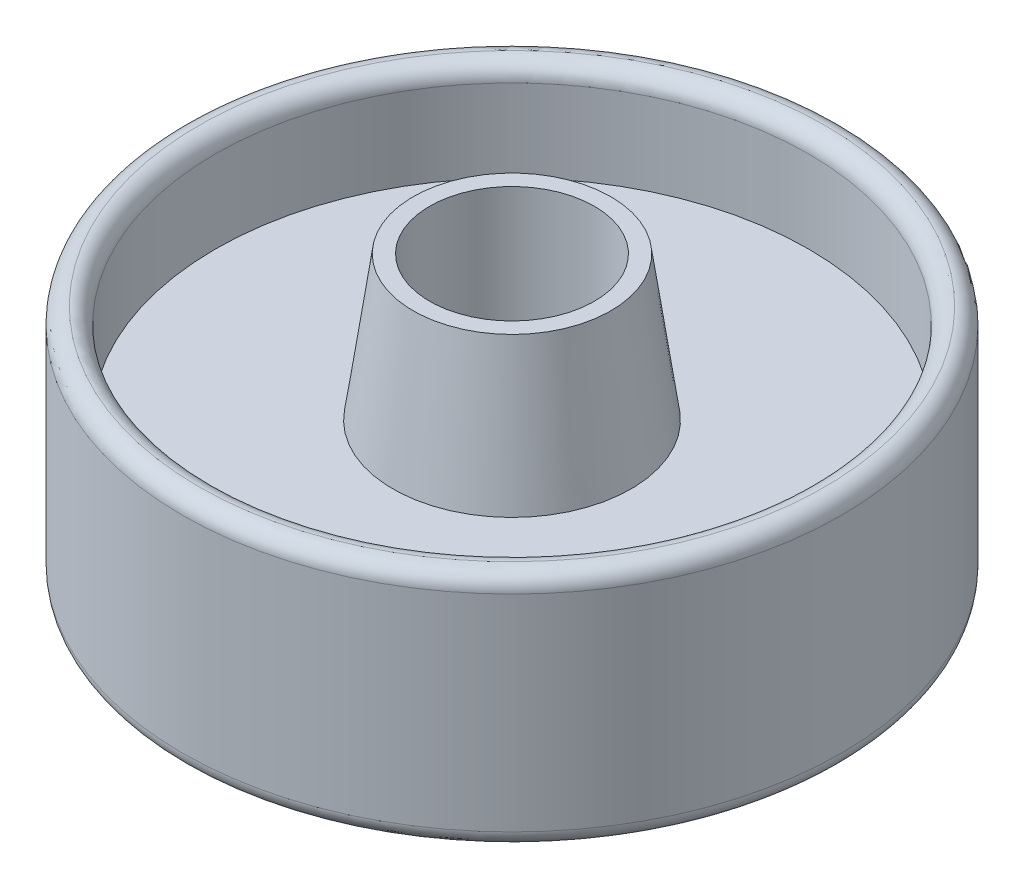
ISO-10303-21;
HEADER;
FILE_DESCRIPTION(('STEP AP214'),'2;1');
FILE_NAME('part.step','',(''),(''),'','','');
FILE_SCHEMA(('AUTOMOTIVE_DESIGN { 1 0 10303 214 1 1 1 1 }'));
ENDSEC;
DATA;
#1=APPLICATION_CONTEXT('core data for automotive mechanical design processes');
#2=APPLICATION_PROTOCOL_DEFINITION('international standard','automotive_design',2000,#1);
#3=PRODUCT_CONTEXT('',#1,'mechanical');
#4=PRODUCT('Part','Part','',(#3));
#5=PRODUCT_RELATED_PRODUCT_CATEGORY('part','',(#4));
#6=PRODUCT_DEFINITION_FORMATION('','',#4);
#7=PRODUCT_DEFINITION_CONTEXT('part definition',#1,'design');
#8=PRODUCT_DEFINITION('design','',#6,#7);
#9=PRODUCT_DEFINITION_SHAPE('','',#8);
#10=(LENGTH_UNIT() NAMED_UNIT(*) SI_UNIT(.MILLI.,.METRE.));
#11=(NAMED_UNIT(*) PLANE_ANGLE_UNIT() SI_UNIT($,.RADIAN.));
#12=(NAMED_UNIT(*) SI_UNIT($,.STERADIAN.) SOLID_ANGLE_UNIT());
#13=UNCERTAINTY_MEASURE_WITH_UNIT(LENGTH_MEASURE(1.E-05),#10,'distance_accuracy_value','');
#14=(GEOMETRIC_REPRESENTATION_CONTEXT(3) GLOBAL_UNCERTAINTY_ASSIGNED_CONTEXT((#13)) GLOBAL_UNIT_ASSIGNED_CONTEXT((#10,
#11,#12)) REPRESENTATION_CONTEXT('',''));
#15=CARTESIAN_POINT('',(0.,0.,0.));
#16=DIRECTION('',(0.,0.,1.));
#17=DIRECTION('',(1.,0.,0.));
#18=AXIS2_PLACEMENT_3D('',#15,#16,#17);
#19=CARTESIAN_POINT('',(0.,-24.5789863778332,0.));
#20=DIRECTION('',(0.,-1.,0.));
#21=DIRECTION('',(0.,0.,-1.));
#22=AXIS2_PLACEMENT_3D('',#19,#20,#21);
#23=CYLINDRICAL_SURFACE('',#22,10.);
#24=CARTESIAN_POINT('',(0.,-20.,0.));
#25=DIRECTION('',(0.,-1.,0.));
#26=DIRECTION('',(0.,0.,-1.));
#27=AXIS2_PLACEMENT_3D('',#24,#25,#26);
#28=CIRCLE('',#27,10.);
#29=CARTESIAN_POINT('',(0.,-20.,-10.));
#30=VERTEX_POINT('',#29);
#31=EDGE_CURVE('E120',#30,#30,#28,.T.);
#32=ORIENTED_EDGE('',*,*,#31,.T.);
#33=EDGE_LOOP('',(#32));
#34=FACE_BOUND('',#33,.T.);
#35=CARTESIAN_POINT('',(0.,20.,0.));
#36=DIRECTION('',(0.,-1.,0.));
#37=DIRECTION('',(0.,0.,-1.));
#38=AXIS2_PLACEMENT_3D('',#35,#36,#37);
#39=CIRCLE('',#38,10.);
#40=CARTESIAN_POINT('',(0.,20.,-10.));
#41=VERTEX_POINT('',#40);
#42=EDGE_CURVE('E58',#41,#41,#39,.T.);
#43=ORIENTED_EDGE('',*,*,#42,.F.);
#44=EDGE_LOOP('',(#43));
#45=FACE_BOUND('',#44,.T.);
#46=ADVANCED_FACE('F37',(#34,#45),#23,.F.);
#47=CARTESIAN_POINT('',(10.,-20.,0.));
#48=DIRECTION('',(0.,-1.,0.));
#49=DIRECTION('',(0.,0.,-1.));
#50=AXIS2_PLACEMENT_3D('',#47,#48,#49);
#51=PLANE('',#50);
#52=CARTESIAN_POINT('',(0.,-20.,0.));
#53=DIRECTION('',(0.,-1.,0.));
#54=DIRECTION('',(0.,0.,-1.));
#55=AXIS2_PLACEMENT_3D('',#52,#53,#54);
#56=CIRCLE('',#55,12.);
#57=CARTESIAN_POINT('',(0.,-20.,-12.));
#58=VERTEX_POINT('',#57);
#59=EDGE_CURVE('E125',#58,#58,#56,.T.);
#60=ORIENTED_EDGE('',*,*,#59,.T.);
#61=EDGE_LOOP('',(#60));
#62=FACE_BOUND('',#61,.T.);
#63=ORIENTED_EDGE('',*,*,#31,.F.);
#64=EDGE_LOOP('',(#63));
#65=FACE_BOUND('',#64,.T.);
#66=ADVANCED_FACE('F84',(#62,#65),#51,.T.);
#67=CARTESIAN_POINT('',(0.,-20.,0.));
#68=DIRECTION('',(0.,1.,0.));
#69=DIRECTION('',(0.,0.,1.));
#70=AXIS2_PLACEMENT_3D('',#67,#68,#69);
#71=CONICAL_SURFACE('',#70,12.,0.13962634015954);
#72=CARTESIAN_POINT('',(0.,-2.5,0.));
#73=DIRECTION('',(0.,-1.,0.));
#74=DIRECTION('',(0.,0.,-1.));
#75=AXIS2_PLACEMENT_3D('',#72,#73,#74);
#76=CIRCLE('',#75,14.4594646072917);
#77=CARTESIAN_POINT('',(0.,-2.5,-14.4594646072917));
#78=VERTEX_POINT('',#77);
#79=EDGE_CURVE('E129',#78,#78,#76,.T.);
#80=ORIENTED_EDGE('',*,*,#79,.T.);
#81=EDGE_LOOP('',(#80));
#82=FACE_BOUND('',#81,.T.);
#83=ORIENTED_EDGE('',*,*,#59,.F.);
#84=EDGE_LOOP('',(#83));
#85=FACE_BOUND('',#84,.T.);
#86=ADVANCED_FACE('F90',(#82,#85),#71,.T.);
#87=CARTESIAN_POINT('',(36.,-2.5,0.));
#88=DIRECTION('',(0.,-1.,0.));
#89=DIRECTION('',(0.,0.,-1.));
#90=AXIS2_PLACEMENT_3D('',#87,#88,#89);
#91=PLANE('',#90);
#92=CARTESIAN_POINT('',(0.,-2.5,0.));
#93=DIRECTION('',(0.,-1.,0.));
#94=DIRECTION('',(0.,0.,-1.));
#95=AXIS2_PLACEMENT_3D('',#92,#93,#94);
#96=CIRCLE('',#95,36.);
#97=CARTESIAN_POINT('',(0.,-2.5,-36.));
#98=VERTEX_POINT('',#97);
#99=EDGE_CURVE('E133',#98,#98,#96,.T.);
#100=ORIENTED_EDGE('',*,*,#99,.T.);
#101=EDGE_LOOP('',(#100));
#102=FACE_BOUND('',#101,.T.);
#103=ORIENTED_EDGE('',*,*,#79,.F.);
#104=EDGE_LOOP('',(#103));
#105=FACE_BOUND('',#104,.T.);
#106=ADVANCED_FACE('F169',(#102,#105),#91,.T.);
#107=CARTESIAN_POINT('',(0.,-24.5789863778332,0.));
#108=DIRECTION('',(0.,-1.,0.));
#109=DIRECTION('',(0.,0.,-1.));
#110=AXIS2_PLACEMENT_3D('',#107,#108,#109);
#111=CYLINDRICAL_SURFACE('',#110,36.);
#112=CARTESIAN_POINT('',(0.,-12.5,0.));
#113=DIRECTION('',(0.,-1.,0.));
#114=DIRECTION('',(0.,0.,-1.));
#115=AXIS2_PLACEMENT_3D('',#112,#113,#114);
#116=CIRCLE('',#115,36.);
#117=CARTESIAN_POINT('',(0.,-12.5,-36.));
#118=VERTEX_POINT('',#117);
#119=EDGE_CURVE('E10',#118,#118,#116,.T.);
#120=ORIENTED_EDGE('',*,*,#119,.T.);
#121=EDGE_LOOP('',(#120));
#122=FACE_BOUND('',#121,.T.);
#123=ORIENTED_EDGE('',*,*,#99,.F.);
#124=EDGE_LOOP('',(#123));
#125=FACE_BOUND('',#124,.T.);
#126=ADVANCED_FACE('F113',(#122,#125),#111,.F.);
#127=CARTESIAN_POINT('',(0.,-24.5789863778332,0.));
#128=DIRECTION('',(0.,-1.,0.));
#129=DIRECTION('',(0.,0.,-1.));
#130=AXIS2_PLACEMENT_3D('',#127,#128,#129);
#131=CYLINDRICAL_SURFACE('',#130,40.);
#132=CARTESIAN_POINT('',(0.,12.5,0.));
#133=DIRECTION('',(0.,1.,0.));
#134=DIRECTION('',(0.,0.,1.));
#135=AXIS2_PLACEMENT_3D('',#132,#133,#134);
#136=CIRCLE('',#135,40.);
#137=CARTESIAN_POINT('',(0.,12.5,40.));
#138=VERTEX_POINT('',#137);
#139=EDGE_CURVE('E46',#138,#138,#136,.F.);
#140=ORIENTED_EDGE('',*,*,#139,.T.);
#141=EDGE_LOOP('',(#140));
#142=FACE_BOUND('',#141,.T.);
#143=CARTESIAN_POINT('',(0.,-12.5,0.));
#144=DIRECTION('',(0.,-1.,0.));
#145=DIRECTION('',(0.,0.,-1.));
#146=AXIS2_PLACEMENT_3D('',#143,#144,#145);
#147=CIRCLE('',#146,40.);
#148=CARTESIAN_POINT('',(0.,-12.5,-40.));
#149=VERTEX_POINT('',#148);
#150=EDGE_CURVE('E52',#149,#149,#147,.F.);
#151=ORIENTED_EDGE('',*,*,#150,.T.);
#152=EDGE_LOOP('',(#151));
#153=FACE_BOUND('',#152,.T.);
#154=ADVANCED_FACE('F109',(#142,#153),#131,.T.);
#155=CARTESIAN_POINT('',(0.,-24.5789863778332,0.));
#156=DIRECTION('',(0.,-1.,0.));
#157=DIRECTION('',(0.,0.,-1.));
#158=AXIS2_PLACEMENT_3D('',#155,#156,#157);
#159=CYLINDRICAL_SURFACE('',#158,36.);
#160=CARTESIAN_POINT('',(0.,12.5,0.));
#161=DIRECTION('',(0.,1.,0.));
#162=DIRECTION('',(0.,0.,1.));
#163=AXIS2_PLACEMENT_3D('',#160,#161,#162);
#164=CIRCLE('',#163,36.);
#165=CARTESIAN_POINT('',(0.,12.5,36.));
#166=VERTEX_POINT('',#165);
#167=EDGE_CURVE('E117',#166,#166,#164,.T.);
#168=ORIENTED_EDGE('',*,*,#167,.T.);
#169=EDGE_LOOP('',(#168));
#170=FACE_BOUND('',#169,.T.);
#171=CARTESIAN_POINT('',(0.,2.5,0.));
#172=DIRECTION('',(0.,-1.,0.));
#173=DIRECTION('',(0.,0.,-1.));
#174=AXIS2_PLACEMENT_3D('',#171,#172,#173);
#175=CIRCLE('',#174,36.);
#176=CARTESIAN_POINT('',(0.,2.5,-36.));
#177=VERTEX_POINT('',#176);
#178=EDGE_CURVE('E137',#177,#177,#175,.T.);
#179=ORIENTED_EDGE('',*,*,#178,.T.);
#180=EDGE_LOOP('',(#179));
#181=FACE_BOUND('',#180,.T.);
#182=ADVANCED_FACE('F112',(#170,#181),#159,.F.);
#183=CARTESIAN_POINT('',(14.4594646072917,2.5,0.));
#184=DIRECTION('',(0.,1.,0.));
#185=DIRECTION('',(0.,0.,1.));
#186=AXIS2_PLACEMENT_3D('',#183,#184,#185);
#187=PLANE('',#186);
#188=CARTESIAN_POINT('',(0.,2.5,0.));
#189=DIRECTION('',(0.,-1.,0.));
#190=DIRECTION('',(0.,0.,-1.));
#191=AXIS2_PLACEMENT_3D('',#188,#189,#190);
#192=CIRCLE('',#191,14.4594646072917);
#193=CARTESIAN_POINT('',(0.,2.5,-14.4594646072917));
#194=VERTEX_POINT('',#193);
#195=EDGE_CURVE('E141',#194,#194,#192,.T.);
#196=ORIENTED_EDGE('',*,*,#195,.T.);
#197=EDGE_LOOP('',(#196));
#198=FACE_BOUND('',#197,.T.);
#199=ORIENTED_EDGE('',*,*,#178,.F.);
#200=EDGE_LOOP('',(#199));
#201=FACE_BOUND('',#200,.T.);
#202=ADVANCED_FACE('F152',(#198,#201),#187,.T.);
#203=CARTESIAN_POINT('',(0.,2.5,0.));
#204=DIRECTION('',(0.,-1.,0.));
#205=DIRECTION('',(0.,0.,-1.));
#206=AXIS2_PLACEMENT_3D('',#203,#204,#205);
#207=CONICAL_SURFACE('',#206,14.4594646072917,0.13962634015954);
#208=CARTESIAN_POINT('',(0.,20.,0.));
#209=DIRECTION('',(0.,-1.,0.));
#210=DIRECTION('',(0.,0.,-1.));
#211=AXIS2_PLACEMENT_3D('',#208,#209,#210);
#212=CIRCLE('',#211,12.);
#213=CARTESIAN_POINT('',(0.,20.,-12.));
#214=VERTEX_POINT('',#213);
#215=EDGE_CURVE('E64',#214,#214,#212,.T.);
#216=ORIENTED_EDGE('',*,*,#215,.T.);
#217=EDGE_LOOP('',(#216));
#218=FACE_BOUND('',#217,.T.);
#219=ORIENTED_EDGE('',*,*,#195,.F.);
#220=EDGE_LOOP('',(#219));
#221=FACE_BOUND('',#220,.T.);
#222=ADVANCED_FACE('F103',(#218,#221),#207,.T.);
#223=CARTESIAN_POINT('',(10.,20.,0.));
#224=DIRECTION('',(0.,1.,0.));
#225=DIRECTION('',(0.,0.,1.));
#226=AXIS2_PLACEMENT_3D('',#223,#224,#225);
#227=PLANE('',#226);
#228=ORIENTED_EDGE('',*,*,#42,.T.);
#229=EDGE_LOOP('',(#228));
#230=FACE_BOUND('',#229,.T.);
#231=ORIENTED_EDGE('',*,*,#215,.F.);
#232=EDGE_LOOP('',(#231));
#233=FACE_BOUND('',#232,.T.);
#234=ADVANCED_FACE('F98',(#230,#233),#227,.T.);
#235=CARTESIAN_POINT('',(0.,12.5,0.));
#236=DIRECTION('',(0.,1.,0.));
#237=DIRECTION('',(0.,0.,1.));
#238=AXIS2_PLACEMENT_3D('',#235,#236,#237);
#239=TOROIDAL_SURFACE('',#238,38.,2.);
#240=ORIENTED_EDGE('',*,*,#139,.F.);
#241=EDGE_LOOP('',(#240));
#242=FACE_BOUND('',#241,.T.);
#243=CARTESIAN_POINT('',(0.,14.5,0.));
#244=DIRECTION('',(0.,1.,0.));
#245=DIRECTION('',(0.,0.,1.));
#246=AXIS2_PLACEMENT_3D('',#243,#244,#245);
#247=CIRCLE('',#246,38.);
#248=CARTESIAN_POINT('',(0.,14.5,38.));
#249=VERTEX_POINT('',#248);
#250=EDGE_CURVE('E55',#249,#249,#247,.T.);
#251=ORIENTED_EDGE('',*,*,#250,.F.);
#252=EDGE_LOOP('',(#251));
#253=FACE_BOUND('',#252,.T.);
#254=ADVANCED_FACE('F79',(#242,#253),#239,.T.);
#255=CARTESIAN_POINT('',(0.,12.5,0.));
#256=DIRECTION('',(0.,1.,0.));
#257=DIRECTION('',(0.,0.,1.));
#258=AXIS2_PLACEMENT_3D('',#255,#256,#257);
#259=TOROIDAL_SURFACE('',#258,38.,2.);
#260=ORIENTED_EDGE('',*,*,#167,.F.);
#261=EDGE_LOOP('',(#260));
#262=FACE_BOUND('',#261,.T.);
#263=ORIENTED_EDGE('',*,*,#250,.T.);
#264=EDGE_LOOP('',(#263));
#265=FACE_BOUND('',#264,.T.);
#266=ADVANCED_FACE('F73',(#262,#265),#259,.T.);
#267=CARTESIAN_POINT('',(0.,-12.5,0.));
#268=DIRECTION('',(0.,-1.,0.));
#269=DIRECTION('',(0.,0.,-1.));
#270=AXIS2_PLACEMENT_3D('',#267,#268,#269);
#271=TOROIDAL_SURFACE('',#270,38.,2.);
#272=ORIENTED_EDGE('',*,*,#150,.F.);
#273=EDGE_LOOP('',(#272));
#274=FACE_BOUND('',#273,.T.);
#275=CARTESIAN_POINT('',(0.,-14.5,0.));
#276=DIRECTION('',(0.,-1.,0.));
#277=DIRECTION('',(0.,0.,-1.));
#278=AXIS2_PLACEMENT_3D('',#275,#276,#277);
#279=CIRCLE('',#278,38.);
#280=CARTESIAN_POINT('',(0.,-14.5,-38.));
#281=VERTEX_POINT('',#280);
#282=EDGE_CURVE('E41',#281,#281,#279,.T.);
#283=ORIENTED_EDGE('',*,*,#282,.F.);
#284=EDGE_LOOP('',(#283));
#285=FACE_BOUND('',#284,.T.);
#286=ADVANCED_FACE('F39',(#274,#285),#271,.T.);
#287=CARTESIAN_POINT('',(0.,-12.5,0.));
#288=DIRECTION('',(0.,-1.,0.));
#289=DIRECTION('',(0.,0.,-1.));
#290=AXIS2_PLACEMENT_3D('',#287,#288,#289);
#291=TOROIDAL_SURFACE('',#290,38.,2.);
#292=ORIENTED_EDGE('',*,*,#282,.T.);
#293=EDGE_LOOP('',(#292));
#294=FACE_BOUND('',#293,.T.);
#295=ORIENTED_EDGE('',*,*,#119,.F.);
#296=EDGE_LOOP('',(#295));
#297=FACE_BOUND('',#296,.T.);
#298=ADVANCED_FACE('F69',(#294,#297),#291,.T.);
#299=CLOSED_SHELL('',(#46,#66,#86,#106,#126,#154,#182,#202,#222,#234,#254,#266,#286,#298));
#300=MANIFOLD_SOLID_BREP('B2',#299);
#301=ADVANCED_BREP_SHAPE_REPRESENTATION('',(#18,#300),#14);
#302=SHAPE_DEFINITION_REPRESENTATION(#9,#301);
ENDSEC;
END-ISO-10303-21;
